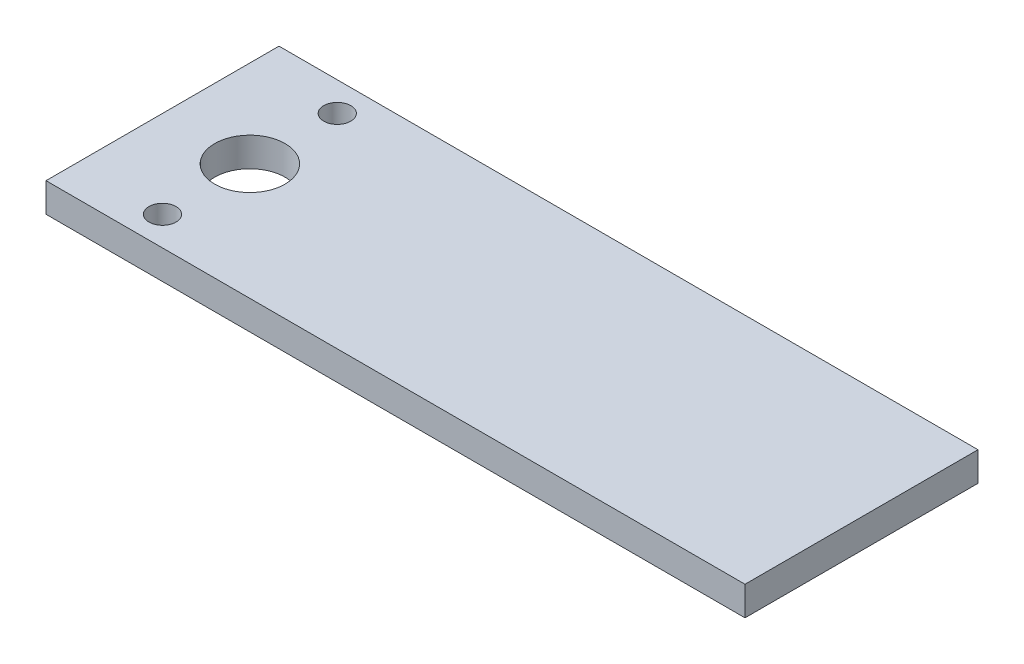
ISO-10303-21;
HEADER;
FILE_DESCRIPTION(('STEP AP214'),'2;1');
FILE_NAME('part.step','',(''),(''),'','','');
FILE_SCHEMA(('AUTOMOTIVE_DESIGN { 1 0 10303 214 1 1 1 1 }'));
ENDSEC;
DATA;
#1=APPLICATION_CONTEXT('core data for automotive mechanical design processes');
#2=APPLICATION_PROTOCOL_DEFINITION('international standard','automotive_design',2000,#1);
#3=PRODUCT_CONTEXT('',#1,'mechanical');
#4=PRODUCT('Part','Part','',(#3));
#5=PRODUCT_RELATED_PRODUCT_CATEGORY('part','',(#4));
#6=PRODUCT_DEFINITION_FORMATION('','',#4);
#7=PRODUCT_DEFINITION_CONTEXT('part definition',#1,'design');
#8=PRODUCT_DEFINITION('design','',#6,#7);
#9=PRODUCT_DEFINITION_SHAPE('','',#8);
#10=(LENGTH_UNIT() NAMED_UNIT(*) SI_UNIT(.MILLI.,.METRE.));
#11=(NAMED_UNIT(*) PLANE_ANGLE_UNIT() SI_UNIT($,.RADIAN.));
#12=(NAMED_UNIT(*) SI_UNIT($,.STERADIAN.) SOLID_ANGLE_UNIT());
#13=UNCERTAINTY_MEASURE_WITH_UNIT(LENGTH_MEASURE(1.E-05),#10,'distance_accuracy_value','');
#14=(GEOMETRIC_REPRESENTATION_CONTEXT(3) GLOBAL_UNCERTAINTY_ASSIGNED_CONTEXT((#13)) GLOBAL_UNIT_ASSIGNED_CONTEXT((#10,
#11,#12)) REPRESENTATION_CONTEXT('',''));
#15=CARTESIAN_POINT('',(0.,0.,0.));
#16=DIRECTION('',(0.,0.,1.));
#17=DIRECTION('',(1.,0.,0.));
#18=AXIS2_PLACEMENT_3D('',#15,#16,#17);
#19=CARTESIAN_POINT('',(0.,3.175,0.));
#20=DIRECTION('',(0.,-1.,0.));
#21=DIRECTION('',(0.,0.,-1.));
#22=AXIS2_PLACEMENT_3D('',#19,#20,#21);
#23=PLANE('',#22);
#24=DIRECTION('',(0.,0.,1.));
#25=VECTOR('',#24,1.);
#26=CARTESIAN_POINT('',(0.,3.175,0.));
#27=LINE('',#26,#25);
#28=CARTESIAN_POINT('',(0.,3.175,-25.4));
#29=VERTEX_POINT('',#28);
#30=CARTESIAN_POINT('',(0.,3.175,0.));
#31=VERTEX_POINT('',#30);
#32=EDGE_CURVE('E91',#29,#31,#27,.T.);
#33=ORIENTED_EDGE('',*,*,#32,.T.);
#34=DIRECTION('',(1.,0.,0.));
#35=VECTOR('',#34,1.);
#36=CARTESIAN_POINT('',(0.,3.175,0.));
#37=LINE('',#36,#35);
#38=CARTESIAN_POINT('',(76.2,3.175,0.));
#39=VERTEX_POINT('',#38);
#40=EDGE_CURVE('E86',#31,#39,#37,.T.);
#41=ORIENTED_EDGE('',*,*,#40,.T.);
#42=DIRECTION('',(0.,0.,-1.));
#43=VECTOR('',#42,1.);
#44=CARTESIAN_POINT('',(76.2,3.175,0.));
#45=LINE('',#44,#43);
#46=CARTESIAN_POINT('',(76.2,3.175,-25.4));
#47=VERTEX_POINT('',#46);
#48=EDGE_CURVE('E89',#39,#47,#45,.T.);
#49=ORIENTED_EDGE('',*,*,#48,.T.);
#50=DIRECTION('',(-1.,0.,0.));
#51=VECTOR('',#50,1.);
#52=CARTESIAN_POINT('',(0.,3.175,-25.4));
#53=LINE('',#52,#51);
#54=EDGE_CURVE('E56',#47,#29,#53,.T.);
#55=ORIENTED_EDGE('',*,*,#54,.T.);
#56=EDGE_LOOP('',(#33,#41,#49,#55));
#57=FACE_BOUND('',#56,.T.);
#58=CARTESIAN_POINT('',(9.525,3.175,-22.225));
#59=DIRECTION('',(0.,1.,0.));
#60=DIRECTION('',(0.,0.,1.));
#61=AXIS2_PLACEMENT_3D('',#58,#59,#60);
#62=CIRCLE('',#61,1.4732);
#63=CARTESIAN_POINT('',(9.525,3.175,-20.7518));
#64=VERTEX_POINT('',#63);
#65=EDGE_CURVE('E106',#64,#64,#62,.T.);
#66=ORIENTED_EDGE('',*,*,#65,.F.);
#67=EDGE_LOOP('',(#66));
#68=FACE_BOUND('',#67,.T.);
#69=CARTESIAN_POINT('',(9.525,3.175,-3.175));
#70=DIRECTION('',(0.,1.,0.));
#71=DIRECTION('',(0.,0.,1.));
#72=AXIS2_PLACEMENT_3D('',#69,#70,#71);
#73=CIRCLE('',#72,1.4732);
#74=CARTESIAN_POINT('',(9.525,3.175,-1.7018));
#75=VERTEX_POINT('',#74);
#76=EDGE_CURVE('E121',#75,#75,#73,.T.);
#77=ORIENTED_EDGE('',*,*,#76,.F.);
#78=EDGE_LOOP('',(#77));
#79=FACE_BOUND('',#78,.T.);
#80=CARTESIAN_POINT('',(9.525,3.175,-12.7));
#81=DIRECTION('',(0.,1.,0.));
#82=DIRECTION('',(0.,0.,1.));
#83=AXIS2_PLACEMENT_3D('',#80,#81,#82);
#84=CIRCLE('',#83,3.8354);
#85=CARTESIAN_POINT('',(9.525,3.175,-8.8646));
#86=VERTEX_POINT('',#85);
#87=EDGE_CURVE('E127',#86,#86,#84,.T.);
#88=ORIENTED_EDGE('',*,*,#87,.F.);
#89=EDGE_LOOP('',(#88));
#90=FACE_BOUND('',#89,.T.);
#91=ADVANCED_FACE('F39',(#57,#68,#79,#90),#23,.F.);
#92=CARTESIAN_POINT('',(0.,0.,0.));
#93=DIRECTION('',(0.,-1.,0.));
#94=DIRECTION('',(0.,0.,-1.));
#95=AXIS2_PLACEMENT_3D('',#92,#93,#94);
#96=PLANE('',#95);
#97=CARTESIAN_POINT('',(9.525,0.,-3.175));
#98=DIRECTION('',(0.,1.,0.));
#99=DIRECTION('',(0.,0.,1.));
#100=AXIS2_PLACEMENT_3D('',#97,#98,#99);
#101=CIRCLE('',#100,1.4732);
#102=CARTESIAN_POINT('',(9.525,0.,-1.7018));
#103=VERTEX_POINT('',#102);
#104=EDGE_CURVE('E124',#103,#103,#101,.T.);
#105=ORIENTED_EDGE('',*,*,#104,.T.);
#106=EDGE_LOOP('',(#105));
#107=FACE_BOUND('',#106,.T.);
#108=DIRECTION('',(0.,0.,1.));
#109=VECTOR('',#108,1.);
#110=CARTESIAN_POINT('',(0.,0.,0.));
#111=LINE('',#110,#109);
#112=CARTESIAN_POINT('',(0.,0.,-25.4));
#113=VERTEX_POINT('',#112);
#114=CARTESIAN_POINT('',(0.,0.,0.));
#115=VERTEX_POINT('',#114);
#116=EDGE_CURVE('E103',#113,#115,#111,.T.);
#117=ORIENTED_EDGE('',*,*,#116,.F.);
#118=DIRECTION('',(-1.,0.,0.));
#119=VECTOR('',#118,1.);
#120=CARTESIAN_POINT('',(0.,0.,-25.4));
#121=LINE('',#120,#119);
#122=CARTESIAN_POINT('',(76.2,0.,-25.4));
#123=VERTEX_POINT('',#122);
#124=EDGE_CURVE('E79',#123,#113,#121,.T.);
#125=ORIENTED_EDGE('',*,*,#124,.F.);
#126=DIRECTION('',(0.,0.,-1.));
#127=VECTOR('',#126,1.);
#128=CARTESIAN_POINT('',(76.2,0.,0.));
#129=LINE('',#128,#127);
#130=CARTESIAN_POINT('',(76.2,0.,0.));
#131=VERTEX_POINT('',#130);
#132=EDGE_CURVE('E73',#131,#123,#129,.T.);
#133=ORIENTED_EDGE('',*,*,#132,.F.);
#134=DIRECTION('',(1.,0.,0.));
#135=VECTOR('',#134,1.);
#136=CARTESIAN_POINT('',(0.,0.,0.));
#137=LINE('',#136,#135);
#138=EDGE_CURVE('E95',#115,#131,#137,.T.);
#139=ORIENTED_EDGE('',*,*,#138,.F.);
#140=EDGE_LOOP('',(#117,#125,#133,#139));
#141=FACE_BOUND('',#140,.T.);
#142=CARTESIAN_POINT('',(9.525,0.,-22.225));
#143=DIRECTION('',(0.,1.,0.));
#144=DIRECTION('',(0.,0.,1.));
#145=AXIS2_PLACEMENT_3D('',#142,#143,#144);
#146=CIRCLE('',#145,1.4732);
#147=CARTESIAN_POINT('',(9.525,0.,-20.7518));
#148=VERTEX_POINT('',#147);
#149=EDGE_CURVE('E118',#148,#148,#146,.T.);
#150=ORIENTED_EDGE('',*,*,#149,.T.);
#151=EDGE_LOOP('',(#150));
#152=FACE_BOUND('',#151,.T.);
#153=CARTESIAN_POINT('',(9.525,0.,-12.7));
#154=DIRECTION('',(0.,1.,0.));
#155=DIRECTION('',(0.,0.,1.));
#156=AXIS2_PLACEMENT_3D('',#153,#154,#155);
#157=CIRCLE('',#156,3.8354);
#158=CARTESIAN_POINT('',(9.525,0.,-8.8646));
#159=VERTEX_POINT('',#158);
#160=EDGE_CURVE('E130',#159,#159,#157,.T.);
#161=ORIENTED_EDGE('',*,*,#160,.T.);
#162=EDGE_LOOP('',(#161));
#163=FACE_BOUND('',#162,.T.);
#164=ADVANCED_FACE('F114',(#107,#141,#152,#163),#96,.T.);
#165=CARTESIAN_POINT('',(0.,3.175,0.));
#166=DIRECTION('',(1.,0.,0.));
#167=DIRECTION('',(0.,0.,-1.));
#168=AXIS2_PLACEMENT_3D('',#165,#166,#167);
#169=PLANE('',#168);
#170=ORIENTED_EDGE('',*,*,#116,.T.);
#171=DIRECTION('',(0.,-1.,0.));
#172=VECTOR('',#171,1.);
#173=CARTESIAN_POINT('',(0.,3.175,0.));
#174=LINE('',#173,#172);
#175=EDGE_CURVE('E11',#31,#115,#174,.T.);
#176=ORIENTED_EDGE('',*,*,#175,.F.);
#177=ORIENTED_EDGE('',*,*,#32,.F.);
#178=DIRECTION('',(0.,-1.,0.));
#179=VECTOR('',#178,1.);
#180=CARTESIAN_POINT('',(0.,3.175,-25.4));
#181=LINE('',#180,#179);
#182=EDGE_CURVE('E99',#29,#113,#181,.T.);
#183=ORIENTED_EDGE('',*,*,#182,.T.);
#184=EDGE_LOOP('',(#170,#176,#177,#183));
#185=FACE_BOUND('',#184,.T.);
#186=ADVANCED_FACE('F41',(#185),#169,.F.);
#187=CARTESIAN_POINT('',(0.,3.175,0.));
#188=DIRECTION('',(0.,0.,-1.));
#189=DIRECTION('',(-1.,0.,0.));
#190=AXIS2_PLACEMENT_3D('',#187,#188,#189);
#191=PLANE('',#190);
#192=ORIENTED_EDGE('',*,*,#138,.T.);
#193=DIRECTION('',(0.,-1.,0.));
#194=VECTOR('',#193,1.);
#195=CARTESIAN_POINT('',(76.2,3.175,0.));
#196=LINE('',#195,#194);
#197=EDGE_CURVE('E48',#39,#131,#196,.T.);
#198=ORIENTED_EDGE('',*,*,#197,.F.);
#199=ORIENTED_EDGE('',*,*,#40,.F.);
#200=ORIENTED_EDGE('',*,*,#175,.T.);
#201=EDGE_LOOP('',(#192,#198,#199,#200));
#202=FACE_BOUND('',#201,.T.);
#203=ADVANCED_FACE('F94',(#202),#191,.F.);
#204=CARTESIAN_POINT('',(76.2,3.175,0.));
#205=DIRECTION('',(-1.,0.,0.));
#206=DIRECTION('',(0.,0.,1.));
#207=AXIS2_PLACEMENT_3D('',#204,#205,#206);
#208=PLANE('',#207);
#209=ORIENTED_EDGE('',*,*,#132,.T.);
#210=DIRECTION('',(0.,-1.,0.));
#211=VECTOR('',#210,1.);
#212=CARTESIAN_POINT('',(76.2,3.175,-25.4));
#213=LINE('',#212,#211);
#214=EDGE_CURVE('E96',#47,#123,#213,.T.);
#215=ORIENTED_EDGE('',*,*,#214,.F.);
#216=ORIENTED_EDGE('',*,*,#48,.F.);
#217=ORIENTED_EDGE('',*,*,#197,.T.);
#218=EDGE_LOOP('',(#209,#215,#216,#217));
#219=FACE_BOUND('',#218,.T.);
#220=ADVANCED_FACE('F97',(#219),#208,.F.);
#221=CARTESIAN_POINT('',(0.,3.175,-25.4));
#222=DIRECTION('',(0.,0.,1.));
#223=DIRECTION('',(1.,0.,0.));
#224=AXIS2_PLACEMENT_3D('',#221,#222,#223);
#225=PLANE('',#224);
#226=ORIENTED_EDGE('',*,*,#124,.T.);
#227=ORIENTED_EDGE('',*,*,#182,.F.);
#228=ORIENTED_EDGE('',*,*,#54,.F.);
#229=ORIENTED_EDGE('',*,*,#214,.T.);
#230=EDGE_LOOP('',(#226,#227,#228,#229));
#231=FACE_BOUND('',#230,.T.);
#232=ADVANCED_FACE('F111',(#231),#225,.F.);
#233=CARTESIAN_POINT('',(9.525,3.175,-22.225));
#234=DIRECTION('',(0.,-1.,0.));
#235=DIRECTION('',(0.,0.,-1.));
#236=AXIS2_PLACEMENT_3D('',#233,#234,#235);
#237=CYLINDRICAL_SURFACE('',#236,1.4732);
#238=ORIENTED_EDGE('',*,*,#65,.T.);
#239=EDGE_LOOP('',(#238));
#240=FACE_BOUND('',#239,.T.);
#241=ORIENTED_EDGE('',*,*,#149,.F.);
#242=EDGE_LOOP('',(#241));
#243=FACE_BOUND('',#242,.T.);
#244=ADVANCED_FACE('F147',(#240,#243),#237,.F.);
#245=CARTESIAN_POINT('',(9.525,3.175,-3.175));
#246=DIRECTION('',(0.,-1.,0.));
#247=DIRECTION('',(0.,0.,-1.));
#248=AXIS2_PLACEMENT_3D('',#245,#246,#247);
#249=CYLINDRICAL_SURFACE('',#248,1.4732);
#250=ORIENTED_EDGE('',*,*,#76,.T.);
#251=EDGE_LOOP('',(#250));
#252=FACE_BOUND('',#251,.T.);
#253=ORIENTED_EDGE('',*,*,#104,.F.);
#254=EDGE_LOOP('',(#253));
#255=FACE_BOUND('',#254,.T.);
#256=ADVANCED_FACE('F182',(#252,#255),#249,.F.);
#257=CARTESIAN_POINT('',(9.525,3.175,-12.7));
#258=DIRECTION('',(0.,-1.,0.));
#259=DIRECTION('',(0.,0.,-1.));
#260=AXIS2_PLACEMENT_3D('',#257,#258,#259);
#261=CYLINDRICAL_SURFACE('',#260,3.8354);
#262=ORIENTED_EDGE('',*,*,#87,.T.);
#263=EDGE_LOOP('',(#262));
#264=FACE_BOUND('',#263,.T.);
#265=ORIENTED_EDGE('',*,*,#160,.F.);
#266=EDGE_LOOP('',(#265));
#267=FACE_BOUND('',#266,.T.);
#268=ADVANCED_FACE('F136',(#264,#267),#261,.F.);
#269=CLOSED_SHELL('',(#91,#164,#186,#203,#220,#232,#244,#256,#268));
#270=MANIFOLD_SOLID_BREP('B2',#269);
#271=ADVANCED_BREP_SHAPE_REPRESENTATION('',(#18,#270),#14);
#272=SHAPE_DEFINITION_REPRESENTATION(#9,#271);
ENDSEC;
END-ISO-10303-21;
